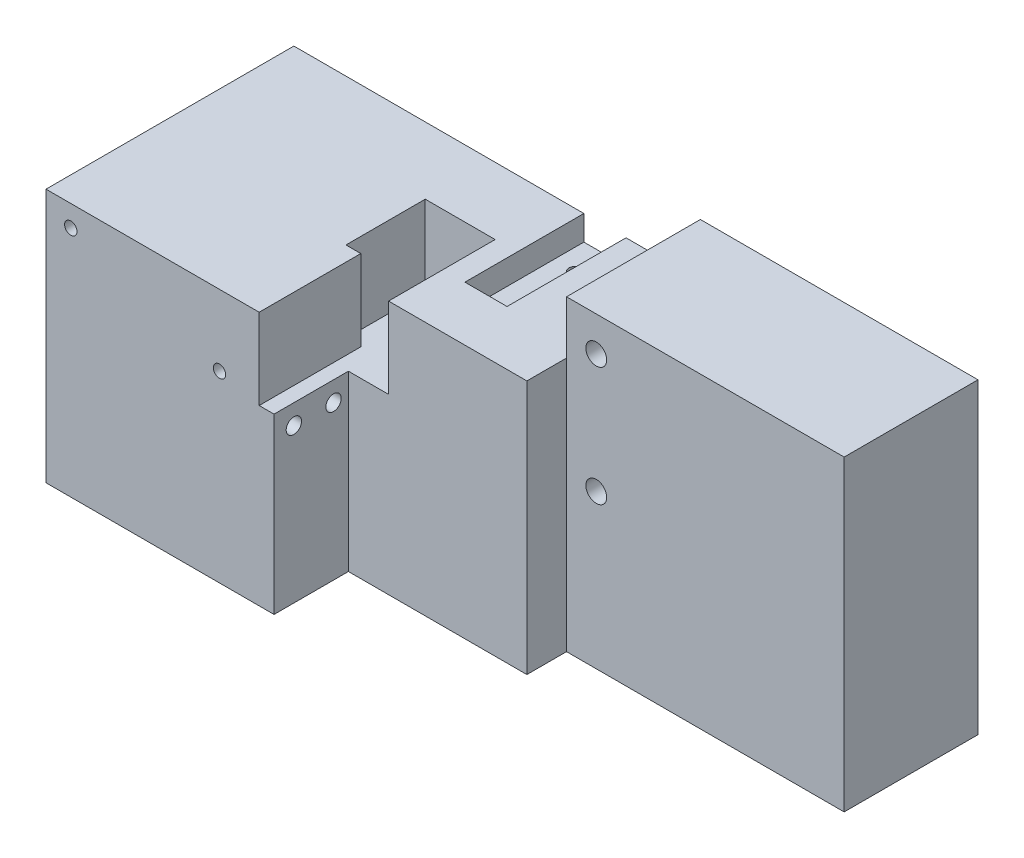
ISO-10303-21;
HEADER;
FILE_DESCRIPTION(('STEP AP214'),'2;1');
FILE_NAME('part.step','',(''),(''),'','','');
FILE_SCHEMA(('AUTOMOTIVE_DESIGN { 1 0 10303 214 1 1 1 1 }'));
ENDSEC;
DATA;
#1=APPLICATION_CONTEXT('core data for automotive mechanical design processes');
#2=APPLICATION_PROTOCOL_DEFINITION('international standard','automotive_design',2000,#1);
#3=PRODUCT_CONTEXT('',#1,'mechanical');
#4=PRODUCT('Part','Part','',(#3));
#5=PRODUCT_RELATED_PRODUCT_CATEGORY('part','',(#4));
#6=PRODUCT_DEFINITION_FORMATION('','',#4);
#7=PRODUCT_DEFINITION_CONTEXT('part definition',#1,'design');
#8=PRODUCT_DEFINITION('design','',#6,#7);
#9=PRODUCT_DEFINITION_SHAPE('','',#8);
#10=(LENGTH_UNIT() NAMED_UNIT(*) SI_UNIT(.MILLI.,.METRE.));
#11=(NAMED_UNIT(*) PLANE_ANGLE_UNIT() SI_UNIT($,.RADIAN.));
#12=(NAMED_UNIT(*) SI_UNIT($,.STERADIAN.) SOLID_ANGLE_UNIT());
#13=UNCERTAINTY_MEASURE_WITH_UNIT(LENGTH_MEASURE(1.E-05),#10,'distance_accuracy_value','');
#14=(GEOMETRIC_REPRESENTATION_CONTEXT(3) GLOBAL_UNCERTAINTY_ASSIGNED_CONTEXT((#13)) GLOBAL_UNIT_ASSIGNED_CONTEXT((#10,
#11,#12)) REPRESENTATION_CONTEXT('',''));
#15=CARTESIAN_POINT('',(0.,0.,0.));
#16=DIRECTION('',(0.,0.,1.));
#17=DIRECTION('',(1.,0.,0.));
#18=AXIS2_PLACEMENT_3D('',#15,#16,#17);
#19=CARTESIAN_POINT('',(138.,-62.,0.));
#20=DIRECTION('',(1.,0.,0.));
#21=DIRECTION('',(0.,0.,-1.));
#22=AXIS2_PLACEMENT_3D('',#19,#20,#21);
#23=PLANE('',#22);
#24=DIRECTION('',(0.,0.,-1.));
#25=VECTOR('',#24,1.);
#26=CARTESIAN_POINT('',(138.,0.,0.));
#27=LINE('',#26,#25);
#28=CARTESIAN_POINT('',(138.,0.,-23.));
#29=VERTEX_POINT('',#28);
#30=CARTESIAN_POINT('',(138.,0.,-50.));
#31=VERTEX_POINT('',#30);
#32=EDGE_CURVE('E451',#29,#31,#27,.T.);
#33=ORIENTED_EDGE('',*,*,#32,.F.);
#34=DIRECTION('',(0.,1.,0.));
#35=VECTOR('',#34,1.);
#36=CARTESIAN_POINT('',(138.,-62.,-23.));
#37=LINE('',#36,#35);
#38=CARTESIAN_POINT('',(138.,-62.,-23.));
#39=VERTEX_POINT('',#38);
#40=EDGE_CURVE('E410',#39,#29,#37,.T.);
#41=ORIENTED_EDGE('',*,*,#40,.F.);
#42=DIRECTION('',(0.,0.,-1.));
#43=VECTOR('',#42,1.);
#44=CARTESIAN_POINT('',(138.,-62.,0.));
#45=LINE('',#44,#43);
#46=CARTESIAN_POINT('',(138.,-62.,-50.));
#47=VERTEX_POINT('',#46);
#48=EDGE_CURVE('E461',#39,#47,#45,.T.);
#49=ORIENTED_EDGE('',*,*,#48,.T.);
#50=DIRECTION('',(0.,1.,0.));
#51=VECTOR('',#50,1.);
#52=CARTESIAN_POINT('',(138.,-62.,-50.));
#53=LINE('',#52,#51);
#54=EDGE_CURVE('E479',#47,#31,#53,.T.);
#55=ORIENTED_EDGE('',*,*,#54,.T.);
#56=EDGE_LOOP('',(#33,#41,#49,#55));
#57=FACE_BOUND('',#56,.T.);
#58=ADVANCED_FACE('F45',(#57),#23,.T.);
#59=CARTESIAN_POINT('',(0.,0.,0.));
#60=DIRECTION('',(0.,-1.,0.));
#61=DIRECTION('',(0.,0.,-1.));
#62=AXIS2_PLACEMENT_3D('',#59,#60,#61);
#63=PLANE('',#62);
#64=DIRECTION('',(-1.,0.,0.));
#65=VECTOR('',#64,1.);
#66=CARTESIAN_POINT('',(138.,0.,-23.));
#67=LINE('',#66,#65);
#68=CARTESIAN_POINT('',(82.,0.,-23.));
#69=VERTEX_POINT('',#68);
#70=EDGE_CURVE('E428',#29,#69,#67,.T.);
#71=ORIENTED_EDGE('',*,*,#70,.F.);
#72=ORIENTED_EDGE('',*,*,#32,.T.);
#73=DIRECTION('',(-1.,0.,0.));
#74=VECTOR('',#73,1.);
#75=CARTESIAN_POINT('',(0.,0.,-50.));
#76=LINE('',#75,#74);
#77=CARTESIAN_POINT('',(82.,0.,-50.));
#78=VERTEX_POINT('',#77);
#79=EDGE_CURVE('E457',#31,#78,#76,.T.);
#80=ORIENTED_EDGE('',*,*,#79,.T.);
#81=DIRECTION('',(0.,0.,1.));
#82=VECTOR('',#81,1.);
#83=CARTESIAN_POINT('',(82.,0.,-50.));
#84=LINE('',#83,#82);
#85=EDGE_CURVE('E447',#78,#69,#84,.T.);
#86=ORIENTED_EDGE('',*,*,#85,.T.);
#87=EDGE_LOOP('',(#71,#72,#80,#86));
#88=FACE_BOUND('',#87,.T.);
#89=ADVANCED_FACE('F563',(#88),#63,.F.);
#90=CARTESIAN_POINT('',(82.,0.,-50.));
#91=DIRECTION('',(1.,0.,0.));
#92=DIRECTION('',(0.,0.,-1.));
#93=AXIS2_PLACEMENT_3D('',#90,#91,#92);
#94=PLANE('',#93);
#95=DIRECTION('',(0.,-1.,0.));
#96=VECTOR('',#95,1.);
#97=CARTESIAN_POINT('',(82.,-62.,-23.));
#98=LINE('',#97,#96);
#99=CARTESIAN_POINT('',(82.,-10.7,-23.));
#100=VERTEX_POINT('',#99);
#101=EDGE_CURVE('E435',#69,#100,#98,.T.);
#102=ORIENTED_EDGE('',*,*,#101,.F.);
#103=ORIENTED_EDGE('',*,*,#85,.F.);
#104=DIRECTION('',(0.,1.,0.));
#105=VECTOR('',#104,1.);
#106=CARTESIAN_POINT('',(82.,0.,-50.));
#107=LINE('',#106,#105);
#108=CARTESIAN_POINT('',(82.,-10.7,-50.));
#109=VERTEX_POINT('',#108);
#110=EDGE_CURVE('E443',#109,#78,#107,.T.);
#111=ORIENTED_EDGE('',*,*,#110,.F.);
#112=DIRECTION('',(0.,0.,1.));
#113=VECTOR('',#112,1.);
#114=CARTESIAN_POINT('',(82.,-10.7,-50.));
#115=LINE('',#114,#113);
#116=EDGE_CURVE('E285',#109,#100,#115,.T.);
#117=ORIENTED_EDGE('',*,*,#116,.T.);
#118=EDGE_LOOP('',(#102,#103,#111,#117));
#119=FACE_BOUND('',#118,.T.);
#120=ADVANCED_FACE('F568',(#119),#94,.F.);
#121=CARTESIAN_POINT('',(0.,-62.,0.));
#122=DIRECTION('',(-1.,0.,0.));
#123=DIRECTION('',(0.,0.,1.));
#124=AXIS2_PLACEMENT_3D('',#121,#122,#123);
#125=PLANE('',#124);
#126=DIRECTION('',(0.,0.,1.));
#127=VECTOR('',#126,1.);
#128=CARTESIAN_POINT('',(0.,-10.7,-50.));
#129=LINE('',#128,#127);
#130=CARTESIAN_POINT('',(0.,-10.7,-50.));
#131=VERTEX_POINT('',#130);
#132=CARTESIAN_POINT('',(0.,-10.7,0.));
#133=VERTEX_POINT('',#132);
#134=EDGE_CURVE('E281',#131,#133,#129,.T.);
#135=ORIENTED_EDGE('',*,*,#134,.F.);
#136=DIRECTION('',(0.,1.,0.));
#137=VECTOR('',#136,1.);
#138=CARTESIAN_POINT('',(0.,-62.,-50.));
#139=LINE('',#138,#137);
#140=CARTESIAN_POINT('',(0.,-62.,-50.));
#141=VERTEX_POINT('',#140);
#142=EDGE_CURVE('E474',#141,#131,#139,.T.);
#143=ORIENTED_EDGE('',*,*,#142,.F.);
#144=DIRECTION('',(0.,0.,1.));
#145=VECTOR('',#144,1.);
#146=CARTESIAN_POINT('',(0.,-62.,0.));
#147=LINE('',#146,#145);
#148=CARTESIAN_POINT('',(0.,-62.,0.));
#149=VERTEX_POINT('',#148);
#150=EDGE_CURVE('E452',#141,#149,#147,.T.);
#151=ORIENTED_EDGE('',*,*,#150,.T.);
#152=DIRECTION('',(0.,1.,0.));
#153=VECTOR('',#152,1.);
#154=CARTESIAN_POINT('',(0.,-62.,0.));
#155=LINE('',#154,#153);
#156=EDGE_CURVE('E468',#149,#133,#155,.T.);
#157=ORIENTED_EDGE('',*,*,#156,.T.);
#158=EDGE_LOOP('',(#135,#143,#151,#157));
#159=FACE_BOUND('',#158,.T.);
#160=ADVANCED_FACE('F47',(#159),#125,.T.);
#161=CARTESIAN_POINT('',(0.,-62.,-50.));
#162=DIRECTION('',(0.,0.,-1.));
#163=DIRECTION('',(-1.,0.,0.));
#164=AXIS2_PLACEMENT_3D('',#161,#162,#163);
#165=PLANE('',#164);
#166=DIRECTION('',(0.,1.,0.));
#167=VECTOR('',#166,1.);
#168=CARTESIAN_POINT('',(58.5,-15.7,-50.));
#169=LINE('',#168,#167);
#170=CARTESIAN_POINT('',(58.5,-15.7,-50.));
#171=VERTEX_POINT('',#170);
#172=CARTESIAN_POINT('',(58.5,-10.7,-50.));
#173=VERTEX_POINT('',#172);
#174=EDGE_CURVE('E264',#171,#173,#169,.T.);
#175=ORIENTED_EDGE('',*,*,#174,.F.);
#176=DIRECTION('',(-1.,0.,0.));
#177=VECTOR('',#176,1.);
#178=CARTESIAN_POINT('',(58.5,-15.7,-50.));
#179=LINE('',#178,#177);
#180=CARTESIAN_POINT('',(67.,-15.7,-50.));
#181=VERTEX_POINT('',#180);
#182=EDGE_CURVE('E251',#181,#171,#179,.T.);
#183=ORIENTED_EDGE('',*,*,#182,.F.);
#184=DIRECTION('',(0.,1.,0.));
#185=VECTOR('',#184,1.);
#186=CARTESIAN_POINT('',(67.,-15.7,-50.));
#187=LINE('',#186,#185);
#188=CARTESIAN_POINT('',(67.,-10.7,-50.));
#189=VERTEX_POINT('',#188);
#190=EDGE_CURVE('E268',#181,#189,#187,.T.);
#191=ORIENTED_EDGE('',*,*,#190,.T.);
#192=DIRECTION('',(1.,0.,0.));
#193=VECTOR('',#192,1.);
#194=CARTESIAN_POINT('',(0.,-10.7,-50.));
#195=LINE('',#194,#193);
#196=EDGE_CURVE('E282',#189,#109,#195,.T.);
#197=ORIENTED_EDGE('',*,*,#196,.T.);
#198=ORIENTED_EDGE('',*,*,#110,.T.);
#199=ORIENTED_EDGE('',*,*,#79,.F.);
#200=ORIENTED_EDGE('',*,*,#54,.F.);
#201=DIRECTION('',(-1.,0.,0.));
#202=VECTOR('',#201,1.);
#203=CARTESIAN_POINT('',(0.,-62.,-50.));
#204=LINE('',#203,#202);
#205=EDGE_CURVE('E464',#47,#141,#204,.T.);
#206=ORIENTED_EDGE('',*,*,#205,.T.);
#207=ORIENTED_EDGE('',*,*,#142,.T.);
#208=EDGE_CURVE('E277',#131,#173,#195,.T.);
#209=ORIENTED_EDGE('',*,*,#208,.T.);
#210=EDGE_LOOP('',(#175,#183,#191,#197,#198,#199,#200,#206,#207,#209));
#211=FACE_BOUND('',#210,.T.);
#212=ADVANCED_FACE('F516',(#211),#165,.T.);
#213=CARTESIAN_POINT('',(0.,-62.,0.));
#214=DIRECTION('',(0.,0.,1.));
#215=DIRECTION('',(1.,0.,0.));
#216=AXIS2_PLACEMENT_3D('',#213,#214,#215);
#217=PLANE('',#216);
#218=DIRECTION('',(1.,0.,0.));
#219=VECTOR('',#218,1.);
#220=CARTESIAN_POINT('',(0.,-10.7,0.));
#221=LINE('',#220,#219);
#222=CARTESIAN_POINT('',(43.,-10.7,0.));
#223=VERTEX_POINT('',#222);
#224=EDGE_CURVE('E267',#133,#223,#221,.T.);
#225=ORIENTED_EDGE('',*,*,#224,.F.);
#226=ORIENTED_EDGE('',*,*,#156,.F.);
#227=DIRECTION('',(1.,0.,0.));
#228=VECTOR('',#227,1.);
#229=CARTESIAN_POINT('',(0.,-62.,0.));
#230=LINE('',#229,#228);
#231=CARTESIAN_POINT('',(46.,-62.,0.));
#232=VERTEX_POINT('',#231);
#233=EDGE_CURVE('E456',#149,#232,#230,.T.);
#234=ORIENTED_EDGE('',*,*,#233,.T.);
#235=DIRECTION('',(0.,1.,0.));
#236=VECTOR('',#235,1.);
#237=CARTESIAN_POINT('',(46.,-62.,0.));
#238=LINE('',#237,#236);
#239=CARTESIAN_POINT('',(46.,-27.,0.));
#240=VERTEX_POINT('',#239);
#241=EDGE_CURVE('E367',#232,#240,#238,.T.);
#242=ORIENTED_EDGE('',*,*,#241,.T.);
#243=DIRECTION('',(1.,0.,0.));
#244=VECTOR('',#243,1.);
#245=CARTESIAN_POINT('',(43.,-27.,0.));
#246=LINE('',#245,#244);
#247=CARTESIAN_POINT('',(43.,-27.,0.));
#248=VERTEX_POINT('',#247);
#249=EDGE_CURVE('E394',#248,#240,#246,.T.);
#250=ORIENTED_EDGE('',*,*,#249,.F.);
#251=DIRECTION('',(0.,1.,0.));
#252=VECTOR('',#251,1.);
#253=CARTESIAN_POINT('',(43.,-27.,0.));
#254=LINE('',#253,#252);
#255=EDGE_CURVE('E415',#248,#223,#254,.T.);
#256=ORIENTED_EDGE('',*,*,#255,.T.);
#257=EDGE_LOOP('',(#225,#226,#234,#242,#250,#256));
#258=FACE_BOUND('',#257,.T.);
#259=CARTESIAN_POINT('',(5.,-15.,0.));
#260=DIRECTION('',(0.,0.,1.));
#261=DIRECTION('',(1.,0.,0.));
#262=AXIS2_PLACEMENT_3D('',#259,#260,#261);
#263=CIRCLE('',#262,1.25);
#264=CARTESIAN_POINT('',(6.25,-15.,0.));
#265=VERTEX_POINT('',#264);
#266=EDGE_CURVE('E342',#265,#265,#263,.T.);
#267=ORIENTED_EDGE('',*,*,#266,.F.);
#268=EDGE_LOOP('',(#267));
#269=FACE_BOUND('',#268,.T.);
#270=CARTESIAN_POINT('',(35.,-25.,0.));
#271=DIRECTION('',(0.,0.,1.));
#272=DIRECTION('',(1.,0.,0.));
#273=AXIS2_PLACEMENT_3D('',#270,#271,#272);
#274=CIRCLE('',#273,1.25);
#275=CARTESIAN_POINT('',(36.25,-25.,0.));
#276=VERTEX_POINT('',#275);
#277=EDGE_CURVE('E350',#276,#276,#274,.T.);
#278=ORIENTED_EDGE('',*,*,#277,.F.);
#279=EDGE_LOOP('',(#278));
#280=FACE_BOUND('',#279,.T.);
#281=ADVANCED_FACE('F498',(#258,#269,#280),#217,.T.);
#282=CARTESIAN_POINT('',(0.,-62.,0.));
#283=DIRECTION('',(0.,-1.,0.));
#284=DIRECTION('',(0.,0.,-1.));
#285=AXIS2_PLACEMENT_3D('',#282,#283,#284);
#286=PLANE('',#285);
#287=CARTESIAN_POINT('',(128.,-62.,-35.));
#288=DIRECTION('',(0.,-1.,0.));
#289=DIRECTION('',(0.,0.,-1.));
#290=AXIS2_PLACEMENT_3D('',#287,#288,#289);
#291=CIRCLE('',#290,1.65000000000001);
#292=CARTESIAN_POINT('',(128.,-62.,-36.65));
#293=VERTEX_POINT('',#292);
#294=EDGE_CURVE('E326',#293,#293,#291,.T.);
#295=ORIENTED_EDGE('',*,*,#294,.F.);
#296=EDGE_LOOP('',(#295));
#297=FACE_BOUND('',#296,.T.);
#298=CARTESIAN_POINT('',(10.,-62.,-35.));
#299=DIRECTION('',(0.,-1.,0.));
#300=DIRECTION('',(0.,0.,-1.));
#301=AXIS2_PLACEMENT_3D('',#298,#299,#300);
#302=CIRCLE('',#301,1.65);
#303=CARTESIAN_POINT('',(10.,-62.,-36.65));
#304=VERTEX_POINT('',#303);
#305=EDGE_CURVE('E334',#304,#304,#302,.T.);
#306=ORIENTED_EDGE('',*,*,#305,.F.);
#307=EDGE_LOOP('',(#306));
#308=FACE_BOUND('',#307,.T.);
#309=DIRECTION('',(0.,0.,1.));
#310=VECTOR('',#309,1.);
#311=CARTESIAN_POINT('',(46.,-62.,0.));
#312=LINE('',#311,#310);
#313=CARTESIAN_POINT('',(46.,-62.,-15.));
#314=VERTEX_POINT('',#313);
#315=EDGE_CURVE('E362',#314,#232,#312,.T.);
#316=ORIENTED_EDGE('',*,*,#315,.T.);
#317=ORIENTED_EDGE('',*,*,#233,.F.);
#318=ORIENTED_EDGE('',*,*,#150,.F.);
#319=ORIENTED_EDGE('',*,*,#205,.F.);
#320=ORIENTED_EDGE('',*,*,#48,.F.);
#321=DIRECTION('',(1.,0.,0.));
#322=VECTOR('',#321,1.);
#323=CARTESIAN_POINT('',(138.,-62.,-23.));
#324=LINE('',#323,#322);
#325=CARTESIAN_POINT('',(82.,-62.,-23.));
#326=VERTEX_POINT('',#325);
#327=EDGE_CURVE('E436',#326,#39,#324,.T.);
#328=ORIENTED_EDGE('',*,*,#327,.F.);
#329=DIRECTION('',(0.,0.,1.));
#330=VECTOR('',#329,1.);
#331=CARTESIAN_POINT('',(82.,-62.,-23.));
#332=LINE('',#331,#330);
#333=CARTESIAN_POINT('',(82.,-62.,-15.));
#334=VERTEX_POINT('',#333);
#335=EDGE_CURVE('E439',#326,#334,#332,.T.);
#336=ORIENTED_EDGE('',*,*,#335,.T.);
#337=DIRECTION('',(-1.,0.,0.));
#338=VECTOR('',#337,1.);
#339=CARTESIAN_POINT('',(82.,-62.,-15.));
#340=LINE('',#339,#338);
#341=EDGE_CURVE('E358',#334,#314,#340,.T.);
#342=ORIENTED_EDGE('',*,*,#341,.T.);
#343=EDGE_LOOP('',(#316,#317,#318,#319,#320,#328,#336,#342));
#344=FACE_BOUND('',#343,.T.);
#345=ADVANCED_FACE('F511',(#297,#308,#344),#286,.T.);
#346=CARTESIAN_POINT('',(82.,-62.,-23.));
#347=DIRECTION('',(-1.,0.,0.));
#348=DIRECTION('',(0.,0.,1.));
#349=AXIS2_PLACEMENT_3D('',#346,#347,#348);
#350=PLANE('',#349);
#351=EDGE_CURVE('E432',#100,#326,#98,.T.);
#352=ORIENTED_EDGE('',*,*,#351,.F.);
#353=CARTESIAN_POINT('',(82.,-10.7,-15.));
#354=VERTEX_POINT('',#353);
#355=EDGE_CURVE('E289',#100,#354,#115,.T.);
#356=ORIENTED_EDGE('',*,*,#355,.T.);
#357=DIRECTION('',(0.,1.,0.));
#358=VECTOR('',#357,1.);
#359=CARTESIAN_POINT('',(82.,-62.,-15.));
#360=LINE('',#359,#358);
#361=EDGE_CURVE('E366',#334,#354,#360,.T.);
#362=ORIENTED_EDGE('',*,*,#361,.F.);
#363=ORIENTED_EDGE('',*,*,#335,.F.);
#364=EDGE_LOOP('',(#352,#356,#362,#363));
#365=FACE_BOUND('',#364,.T.);
#366=ADVANCED_FACE('F531',(#365),#350,.F.);
#367=CARTESIAN_POINT('',(0.,0.,-23.));
#368=DIRECTION('',(0.,0.,1.));
#369=DIRECTION('',(1.,0.,0.));
#370=AXIS2_PLACEMENT_3D('',#367,#368,#369);
#371=PLANE('',#370);
#372=CARTESIAN_POINT('',(88.,-7.,-23.));
#373=DIRECTION('',(0.,0.,1.));
#374=DIRECTION('',(1.,0.,0.));
#375=AXIS2_PLACEMENT_3D('',#372,#373,#374);
#376=CIRCLE('',#375,2.1);
#377=CARTESIAN_POINT('',(90.1,-7.,-23.));
#378=VERTEX_POINT('',#377);
#379=EDGE_CURVE('E216',#378,#378,#376,.T.);
#380=ORIENTED_EDGE('',*,*,#379,.F.);
#381=EDGE_LOOP('',(#380));
#382=FACE_BOUND('',#381,.T.);
#383=CARTESIAN_POINT('',(88.,-31.,-23.));
#384=DIRECTION('',(0.,0.,1.));
#385=DIRECTION('',(1.,0.,0.));
#386=AXIS2_PLACEMENT_3D('',#383,#384,#385);
#387=CIRCLE('',#386,2.1);
#388=CARTESIAN_POINT('',(90.1,-31.,-23.));
#389=VERTEX_POINT('',#388);
#390=EDGE_CURVE('E215',#389,#389,#387,.T.);
#391=ORIENTED_EDGE('',*,*,#390,.F.);
#392=EDGE_LOOP('',(#391));
#393=FACE_BOUND('',#392,.T.);
#394=ORIENTED_EDGE('',*,*,#40,.T.);
#395=ORIENTED_EDGE('',*,*,#70,.T.);
#396=ORIENTED_EDGE('',*,*,#101,.T.);
#397=ORIENTED_EDGE('',*,*,#351,.T.);
#398=ORIENTED_EDGE('',*,*,#327,.T.);
#399=EDGE_LOOP('',(#394,#395,#396,#397,#398));
#400=FACE_BOUND('',#399,.T.);
#401=ADVANCED_FACE('F524',(#382,#393,#400),#371,.T.);
#402=CARTESIAN_POINT('',(40.,-27.,-36.5));
#403=DIRECTION('',(-1.,0.,0.));
#404=DIRECTION('',(0.,0.,1.));
#405=AXIS2_PLACEMENT_3D('',#402,#403,#404);
#406=PLANE('',#405);
#407=DIRECTION('',(0.,1.,0.));
#408=VECTOR('',#407,1.);
#409=CARTESIAN_POINT('',(40.,-27.,-36.5));
#410=LINE('',#409,#408);
#411=CARTESIAN_POINT('',(40.,-27.,-36.5));
#412=VERTEX_POINT('',#411);
#413=CARTESIAN_POINT('',(40.,-10.7,-36.5));
#414=VERTEX_POINT('',#413);
#415=EDGE_CURVE('E406',#412,#414,#410,.T.);
#416=ORIENTED_EDGE('',*,*,#415,.T.);
#417=DIRECTION('',(0.,0.,1.));
#418=VECTOR('',#417,1.);
#419=CARTESIAN_POINT('',(40.,-10.7,-36.5));
#420=LINE('',#419,#418);
#421=CARTESIAN_POINT('',(40.,-10.7,-20.5));
#422=VERTEX_POINT('',#421);
#423=EDGE_CURVE('E298',#414,#422,#420,.T.);
#424=ORIENTED_EDGE('',*,*,#423,.T.);
#425=DIRECTION('',(0.,1.,0.));
#426=VECTOR('',#425,1.);
#427=CARTESIAN_POINT('',(40.,-27.,-20.5));
#428=LINE('',#427,#426);
#429=CARTESIAN_POINT('',(40.,-27.,-20.5));
#430=VERTEX_POINT('',#429);
#431=EDGE_CURVE('E405',#430,#422,#428,.T.);
#432=ORIENTED_EDGE('',*,*,#431,.F.);
#433=DIRECTION('',(0.,0.,1.));
#434=VECTOR('',#433,1.);
#435=CARTESIAN_POINT('',(40.,-27.,-36.5));
#436=LINE('',#435,#434);
#437=EDGE_CURVE('E382',#412,#430,#436,.T.);
#438=ORIENTED_EDGE('',*,*,#437,.F.);
#439=EDGE_LOOP('',(#416,#424,#432,#438));
#440=FACE_BOUND('',#439,.T.);
#441=ADVANCED_FACE('F543',(#440),#406,.F.);
#442=CARTESIAN_POINT('',(40.,-27.,-36.5));
#443=DIRECTION('',(0.,0.,-1.));
#444=DIRECTION('',(-1.,0.,0.));
#445=AXIS2_PLACEMENT_3D('',#442,#443,#444);
#446=PLANE('',#445);
#447=DIRECTION('',(0.,1.,0.));
#448=VECTOR('',#447,1.);
#449=CARTESIAN_POINT('',(54.1,-27.,-36.5));
#450=LINE('',#449,#448);
#451=CARTESIAN_POINT('',(54.1,-27.,-36.5));
#452=VERTEX_POINT('',#451);
#453=CARTESIAN_POINT('',(54.1,-10.7,-36.5));
#454=VERTEX_POINT('',#453);
#455=EDGE_CURVE('E411',#452,#454,#450,.T.);
#456=ORIENTED_EDGE('',*,*,#455,.T.);
#457=DIRECTION('',(-1.,0.,0.));
#458=VECTOR('',#457,1.);
#459=CARTESIAN_POINT('',(40.,-10.7,-36.5));
#460=LINE('',#459,#458);
#461=EDGE_CURVE('E294',#454,#414,#460,.T.);
#462=ORIENTED_EDGE('',*,*,#461,.T.);
#463=ORIENTED_EDGE('',*,*,#415,.F.);
#464=DIRECTION('',(-1.,0.,0.));
#465=VECTOR('',#464,1.);
#466=CARTESIAN_POINT('',(40.,-27.,-36.5));
#467=LINE('',#466,#465);
#468=EDGE_CURVE('E401',#452,#412,#467,.T.);
#469=ORIENTED_EDGE('',*,*,#468,.F.);
#470=EDGE_LOOP('',(#456,#462,#463,#469));
#471=FACE_BOUND('',#470,.T.);
#472=ADVANCED_FACE('F540',(#471),#446,.F.);
#473=CARTESIAN_POINT('',(54.1,-27.,-36.5));
#474=DIRECTION('',(1.,0.,0.));
#475=DIRECTION('',(0.,0.,-1.));
#476=AXIS2_PLACEMENT_3D('',#473,#474,#475);
#477=PLANE('',#476);
#478=DIRECTION('',(0.,1.,0.));
#479=VECTOR('',#478,1.);
#480=CARTESIAN_POINT('',(54.1,-27.,-15.));
#481=LINE('',#480,#479);
#482=CARTESIAN_POINT('',(54.1,-27.,-15.));
#483=VERTEX_POINT('',#482);
#484=CARTESIAN_POINT('',(54.1,-10.7,-15.));
#485=VERTEX_POINT('',#484);
#486=EDGE_CURVE('E371',#483,#485,#481,.T.);
#487=ORIENTED_EDGE('',*,*,#486,.T.);
#488=DIRECTION('',(0.,0.,-1.));
#489=VECTOR('',#488,1.);
#490=CARTESIAN_POINT('',(54.1,-10.7,-36.5));
#491=LINE('',#490,#489);
#492=EDGE_CURVE('E69',#485,#454,#491,.T.);
#493=ORIENTED_EDGE('',*,*,#492,.T.);
#494=ORIENTED_EDGE('',*,*,#455,.F.);
#495=DIRECTION('',(0.,0.,-1.));
#496=VECTOR('',#495,1.);
#497=CARTESIAN_POINT('',(54.1,-27.,-36.5));
#498=LINE('',#497,#496);
#499=EDGE_CURVE('E398',#483,#452,#498,.T.);
#500=ORIENTED_EDGE('',*,*,#499,.F.);
#501=EDGE_LOOP('',(#487,#493,#494,#500));
#502=FACE_BOUND('',#501,.T.);
#503=ADVANCED_FACE('F537',(#502),#477,.F.);
#504=CARTESIAN_POINT('',(43.,-27.,-20.5));
#505=DIRECTION('',(-1.,0.,0.));
#506=DIRECTION('',(0.,0.,1.));
#507=AXIS2_PLACEMENT_3D('',#504,#505,#506);
#508=PLANE('',#507);
#509=DIRECTION('',(0.,1.,0.));
#510=VECTOR('',#509,1.);
#511=CARTESIAN_POINT('',(43.,-27.,-20.5));
#512=LINE('',#511,#510);
#513=CARTESIAN_POINT('',(43.,-27.,-20.5));
#514=VERTEX_POINT('',#513);
#515=CARTESIAN_POINT('',(43.,-10.7,-20.5));
#516=VERTEX_POINT('',#515);
#517=EDGE_CURVE('E419',#514,#516,#512,.T.);
#518=ORIENTED_EDGE('',*,*,#517,.T.);
#519=DIRECTION('',(0.,0.,1.));
#520=VECTOR('',#519,1.);
#521=CARTESIAN_POINT('',(43.,-10.7,-20.5));
#522=LINE('',#521,#520);
#523=EDGE_CURVE('E306',#516,#223,#522,.T.);
#524=ORIENTED_EDGE('',*,*,#523,.T.);
#525=ORIENTED_EDGE('',*,*,#255,.F.);
#526=DIRECTION('',(0.,0.,1.));
#527=VECTOR('',#526,1.);
#528=CARTESIAN_POINT('',(43.,-27.,-20.5));
#529=LINE('',#528,#527);
#530=EDGE_CURVE('E390',#514,#248,#529,.T.);
#531=ORIENTED_EDGE('',*,*,#530,.F.);
#532=EDGE_LOOP('',(#518,#524,#525,#531));
#533=FACE_BOUND('',#532,.T.);
#534=ADVANCED_FACE('F505',(#533),#508,.F.);
#535=CARTESIAN_POINT('',(40.,-27.,-20.5));
#536=DIRECTION('',(0.,0.,1.));
#537=DIRECTION('',(1.,0.,0.));
#538=AXIS2_PLACEMENT_3D('',#535,#536,#537);
#539=PLANE('',#538);
#540=ORIENTED_EDGE('',*,*,#431,.T.);
#541=DIRECTION('',(1.,0.,0.));
#542=VECTOR('',#541,1.);
#543=CARTESIAN_POINT('',(40.,-10.7,-20.5));
#544=LINE('',#543,#542);
#545=EDGE_CURVE('E302',#422,#516,#544,.T.);
#546=ORIENTED_EDGE('',*,*,#545,.T.);
#547=ORIENTED_EDGE('',*,*,#517,.F.);
#548=DIRECTION('',(1.,0.,0.));
#549=VECTOR('',#548,1.);
#550=CARTESIAN_POINT('',(40.,-27.,-20.5));
#551=LINE('',#550,#549);
#552=EDGE_CURVE('E386',#430,#514,#551,.T.);
#553=ORIENTED_EDGE('',*,*,#552,.F.);
#554=EDGE_LOOP('',(#540,#546,#547,#553));
#555=FACE_BOUND('',#554,.T.);
#556=ADVANCED_FACE('F545',(#555),#539,.F.);
#557=CARTESIAN_POINT('',(0.,-27.,0.));
#558=DIRECTION('',(0.,1.,0.));
#559=DIRECTION('',(0.,0.,1.));
#560=AXIS2_PLACEMENT_3D('',#557,#558,#559);
#561=PLANE('',#560);
#562=DIRECTION('',(0.,0.,1.));
#563=VECTOR('',#562,1.);
#564=CARTESIAN_POINT('',(46.,-27.,0.));
#565=LINE('',#564,#563);
#566=CARTESIAN_POINT('',(46.,-27.,-15.));
#567=VERTEX_POINT('',#566);
#568=EDGE_CURVE('E54',#567,#240,#565,.T.);
#569=ORIENTED_EDGE('',*,*,#568,.F.);
#570=DIRECTION('',(-1.,0.,0.));
#571=VECTOR('',#570,1.);
#572=CARTESIAN_POINT('',(0.,-27.,-15.));
#573=LINE('',#572,#571);
#574=EDGE_CURVE('E478',#483,#567,#573,.T.);
#575=ORIENTED_EDGE('',*,*,#574,.F.);
#576=ORIENTED_EDGE('',*,*,#499,.T.);
#577=ORIENTED_EDGE('',*,*,#468,.T.);
#578=ORIENTED_EDGE('',*,*,#437,.T.);
#579=ORIENTED_EDGE('',*,*,#552,.T.);
#580=ORIENTED_EDGE('',*,*,#530,.T.);
#581=ORIENTED_EDGE('',*,*,#249,.T.);
#582=EDGE_LOOP('',(#569,#575,#576,#577,#578,#579,#580,#581));
#583=FACE_BOUND('',#582,.T.);
#584=ADVANCED_FACE('F501',(#583),#561,.T.);
#585=CARTESIAN_POINT('',(82.,-62.,-15.));
#586=DIRECTION('',(0.,0.,-1.));
#587=DIRECTION('',(-1.,0.,0.));
#588=AXIS2_PLACEMENT_3D('',#585,#586,#587);
#589=PLANE('',#588);
#590=ORIENTED_EDGE('',*,*,#361,.T.);
#591=DIRECTION('',(-1.,0.,0.));
#592=VECTOR('',#591,1.);
#593=CARTESIAN_POINT('',(82.,-10.7,-15.));
#594=LINE('',#593,#592);
#595=EDGE_CURVE('E11',#354,#485,#594,.T.);
#596=ORIENTED_EDGE('',*,*,#595,.T.);
#597=ORIENTED_EDGE('',*,*,#486,.F.);
#598=ORIENTED_EDGE('',*,*,#574,.T.);
#599=DIRECTION('',(0.,1.,0.));
#600=VECTOR('',#599,1.);
#601=CARTESIAN_POINT('',(46.,-62.,-15.));
#602=LINE('',#601,#600);
#603=EDGE_CURVE('E372',#314,#567,#602,.T.);
#604=ORIENTED_EDGE('',*,*,#603,.F.);
#605=ORIENTED_EDGE('',*,*,#341,.F.);
#606=EDGE_LOOP('',(#590,#596,#597,#598,#604,#605));
#607=FACE_BOUND('',#606,.T.);
#608=ADVANCED_FACE('F533',(#607),#589,.F.);
#609=CARTESIAN_POINT('',(46.,-62.,0.));
#610=DIRECTION('',(-1.,0.,0.));
#611=DIRECTION('',(0.,0.,1.));
#612=AXIS2_PLACEMENT_3D('',#609,#610,#611);
#613=PLANE('',#612);
#614=CARTESIAN_POINT('',(46.,-31.,-3.99999999999999));
#615=DIRECTION('',(1.,0.,0.));
#616=DIRECTION('',(0.,0.,-1.));
#617=AXIS2_PLACEMENT_3D('',#614,#615,#616);
#618=CIRCLE('',#617,1.54999999999999);
#619=CARTESIAN_POINT('',(46.,-31.,-5.54999999999998));
#620=VERTEX_POINT('',#619);
#621=EDGE_CURVE('E310',#620,#620,#618,.T.);
#622=ORIENTED_EDGE('',*,*,#621,.F.);
#623=EDGE_LOOP('',(#622));
#624=FACE_BOUND('',#623,.T.);
#625=CARTESIAN_POINT('',(46.,-31.,-12.));
#626=DIRECTION('',(1.,0.,0.));
#627=DIRECTION('',(0.,0.,-1.));
#628=AXIS2_PLACEMENT_3D('',#625,#626,#627);
#629=CIRCLE('',#628,1.54999999999999);
#630=CARTESIAN_POINT('',(46.,-31.,-13.55));
#631=VERTEX_POINT('',#630);
#632=EDGE_CURVE('E318',#631,#631,#629,.T.);
#633=ORIENTED_EDGE('',*,*,#632,.F.);
#634=EDGE_LOOP('',(#633));
#635=FACE_BOUND('',#634,.T.);
#636=ORIENTED_EDGE('',*,*,#568,.T.);
#637=ORIENTED_EDGE('',*,*,#241,.F.);
#638=ORIENTED_EDGE('',*,*,#315,.F.);
#639=ORIENTED_EDGE('',*,*,#603,.T.);
#640=EDGE_LOOP('',(#636,#637,#638,#639));
#641=FACE_BOUND('',#640,.T.);
#642=ADVANCED_FACE('F491',(#624,#635,#641),#613,.F.);
#643=CARTESIAN_POINT('',(35.,-25.,-12.4));
#644=DIRECTION('',(0.,0.,1.));
#645=DIRECTION('',(1.,0.,0.));
#646=AXIS2_PLACEMENT_3D('',#643,#644,#645);
#647=CONICAL_SURFACE('',#646,1.24999999999999,1.02974425867665);
#648=CARTESIAN_POINT('',(35.,-25.,-13.1510757737845));
#649=VERTEX_POINT('',#648);
#650=VERTEX_LOOP('',#649);
#651=FACE_BOUND('',#650,.T.);
#652=CARTESIAN_POINT('',(35.,-25.,-12.4));
#653=DIRECTION('',(0.,0.,1.));
#654=DIRECTION('',(1.,0.,0.));
#655=AXIS2_PLACEMENT_3D('',#652,#653,#654);
#656=CIRCLE('',#655,1.24999999999999);
#657=CARTESIAN_POINT('',(36.25,-25.,-12.4));
#658=VERTEX_POINT('',#657);
#659=EDGE_CURVE('E354',#658,#658,#656,.T.);
#660=ORIENTED_EDGE('',*,*,#659,.T.);
#661=EDGE_LOOP('',(#660));
#662=FACE_BOUND('',#661,.T.);
#663=ADVANCED_FACE('F611',(#651,#662),#647,.F.);
#664=CARTESIAN_POINT('',(35.,-25.,0.));
#665=DIRECTION('',(0.,0.,1.));
#666=DIRECTION('',(1.,0.,0.));
#667=AXIS2_PLACEMENT_3D('',#664,#665,#666);
#668=CYLINDRICAL_SURFACE('',#667,1.25);
#669=ORIENTED_EDGE('',*,*,#659,.F.);
#670=EDGE_LOOP('',(#669));
#671=FACE_BOUND('',#670,.T.);
#672=ORIENTED_EDGE('',*,*,#277,.T.);
#673=EDGE_LOOP('',(#672));
#674=FACE_BOUND('',#673,.T.);
#675=ADVANCED_FACE('F615',(#671,#674),#668,.F.);
#676=CARTESIAN_POINT('',(5.,-15.,-12.4));
#677=DIRECTION('',(0.,0.,1.));
#678=DIRECTION('',(1.,0.,0.));
#679=AXIS2_PLACEMENT_3D('',#676,#677,#678);
#680=CONICAL_SURFACE('',#679,1.25,1.02974425867665);
#681=CARTESIAN_POINT('',(5.,-15.,-13.1510757737845));
#682=VERTEX_POINT('',#681);
#683=VERTEX_LOOP('',#682);
#684=FACE_BOUND('',#683,.T.);
#685=CARTESIAN_POINT('',(5.,-15.,-12.4));
#686=DIRECTION('',(0.,0.,1.));
#687=DIRECTION('',(1.,0.,0.));
#688=AXIS2_PLACEMENT_3D('',#685,#686,#687);
#689=CIRCLE('',#688,1.25);
#690=CARTESIAN_POINT('',(6.25,-15.,-12.4));
#691=VERTEX_POINT('',#690);
#692=EDGE_CURVE('E346',#691,#691,#689,.T.);
#693=ORIENTED_EDGE('',*,*,#692,.T.);
#694=EDGE_LOOP('',(#693));
#695=FACE_BOUND('',#694,.T.);
#696=ADVANCED_FACE('F619',(#684,#695),#680,.F.);
#697=CARTESIAN_POINT('',(5.,-15.,0.));
#698=DIRECTION('',(0.,0.,1.));
#699=DIRECTION('',(1.,0.,0.));
#700=AXIS2_PLACEMENT_3D('',#697,#698,#699);
#701=CYLINDRICAL_SURFACE('',#700,1.25);
#702=ORIENTED_EDGE('',*,*,#692,.F.);
#703=EDGE_LOOP('',(#702));
#704=FACE_BOUND('',#703,.T.);
#705=ORIENTED_EDGE('',*,*,#266,.T.);
#706=EDGE_LOOP('',(#705));
#707=FACE_BOUND('',#706,.T.);
#708=ADVANCED_FACE('F623',(#704,#707),#701,.F.);
#709=CARTESIAN_POINT('',(10.,-51.9,-35.));
#710=DIRECTION('',(0.,-1.,0.));
#711=DIRECTION('',(0.,0.,-1.));
#712=AXIS2_PLACEMENT_3D('',#709,#710,#711);
#713=CONICAL_SURFACE('',#712,1.65,1.02974425867665);
#714=CARTESIAN_POINT('',(10.,-50.9085799786045,-35.));
#715=VERTEX_POINT('',#714);
#716=VERTEX_LOOP('',#715);
#717=FACE_BOUND('',#716,.T.);
#718=CARTESIAN_POINT('',(10.,-51.9,-35.));
#719=DIRECTION('',(0.,-1.,0.));
#720=DIRECTION('',(0.,0.,-1.));
#721=AXIS2_PLACEMENT_3D('',#718,#719,#720);
#722=CIRCLE('',#721,1.65);
#723=CARTESIAN_POINT('',(10.,-51.9,-36.65));
#724=VERTEX_POINT('',#723);
#725=EDGE_CURVE('E338',#724,#724,#722,.T.);
#726=ORIENTED_EDGE('',*,*,#725,.T.);
#727=EDGE_LOOP('',(#726));
#728=FACE_BOUND('',#727,.T.);
#729=ADVANCED_FACE('F627',(#717,#728),#713,.F.);
#730=CARTESIAN_POINT('',(10.,-62.,-35.));
#731=DIRECTION('',(0.,-1.,0.));
#732=DIRECTION('',(0.,0.,-1.));
#733=AXIS2_PLACEMENT_3D('',#730,#731,#732);
#734=CYLINDRICAL_SURFACE('',#733,1.65);
#735=ORIENTED_EDGE('',*,*,#725,.F.);
#736=EDGE_LOOP('',(#735));
#737=FACE_BOUND('',#736,.T.);
#738=ORIENTED_EDGE('',*,*,#305,.T.);
#739=EDGE_LOOP('',(#738));
#740=FACE_BOUND('',#739,.T.);
#741=ADVANCED_FACE('F631',(#737,#740),#734,.F.);
#742=CARTESIAN_POINT('',(128.,-51.9,-35.));
#743=DIRECTION('',(0.,-1.,0.));
#744=DIRECTION('',(0.,0.,-1.));
#745=AXIS2_PLACEMENT_3D('',#742,#743,#744);
#746=CONICAL_SURFACE('',#745,1.64999999999998,1.02974425867665);
#747=CARTESIAN_POINT('',(128.,-50.9085799786045,-35.));
#748=VERTEX_POINT('',#747);
#749=VERTEX_LOOP('',#748);
#750=FACE_BOUND('',#749,.T.);
#751=CARTESIAN_POINT('',(128.,-51.9,-35.));
#752=DIRECTION('',(0.,-1.,0.));
#753=DIRECTION('',(0.,0.,-1.));
#754=AXIS2_PLACEMENT_3D('',#751,#752,#753);
#755=CIRCLE('',#754,1.64999999999998);
#756=CARTESIAN_POINT('',(128.,-51.9,-36.65));
#757=VERTEX_POINT('',#756);
#758=EDGE_CURVE('E330',#757,#757,#755,.T.);
#759=ORIENTED_EDGE('',*,*,#758,.T.);
#760=EDGE_LOOP('',(#759));
#761=FACE_BOUND('',#760,.T.);
#762=ADVANCED_FACE('F635',(#750,#761),#746,.F.);
#763=CARTESIAN_POINT('',(128.,-62.,-35.));
#764=DIRECTION('',(0.,-1.,0.));
#765=DIRECTION('',(0.,0.,-1.));
#766=AXIS2_PLACEMENT_3D('',#763,#764,#765);
#767=CYLINDRICAL_SURFACE('',#766,1.65);
#768=ORIENTED_EDGE('',*,*,#758,.F.);
#769=EDGE_LOOP('',(#768));
#770=FACE_BOUND('',#769,.T.);
#771=ORIENTED_EDGE('',*,*,#294,.T.);
#772=EDGE_LOOP('',(#771));
#773=FACE_BOUND('',#772,.T.);
#774=ADVANCED_FACE('F639',(#770,#773),#767,.F.);
#775=CARTESIAN_POINT('',(36.,-31.,-12.));
#776=DIRECTION('',(1.,0.,0.));
#777=DIRECTION('',(0.,0.,-1.));
#778=AXIS2_PLACEMENT_3D('',#775,#776,#777);
#779=CONICAL_SURFACE('',#778,1.54999999999999,1.02974425867665);
#780=CARTESIAN_POINT('',(35.0686660405073,-31.,-12.));
#781=VERTEX_POINT('',#780);
#782=VERTEX_LOOP('',#781);
#783=FACE_BOUND('',#782,.T.);
#784=CARTESIAN_POINT('',(36.,-31.,-12.));
#785=DIRECTION('',(1.,0.,0.));
#786=DIRECTION('',(0.,0.,-1.));
#787=AXIS2_PLACEMENT_3D('',#784,#785,#786);
#788=CIRCLE('',#787,1.54999999999999);
#789=CARTESIAN_POINT('',(36.,-31.,-13.55));
#790=VERTEX_POINT('',#789);
#791=EDGE_CURVE('E322',#790,#790,#788,.T.);
#792=ORIENTED_EDGE('',*,*,#791,.T.);
#793=EDGE_LOOP('',(#792));
#794=FACE_BOUND('',#793,.T.);
#795=ADVANCED_FACE('F643',(#783,#794),#779,.F.);
#796=CARTESIAN_POINT('',(46.,-31.,-12.));
#797=DIRECTION('',(1.,0.,0.));
#798=DIRECTION('',(0.,0.,-1.));
#799=AXIS2_PLACEMENT_3D('',#796,#797,#798);
#800=CYLINDRICAL_SURFACE('',#799,1.54999999999999);
#801=ORIENTED_EDGE('',*,*,#791,.F.);
#802=EDGE_LOOP('',(#801));
#803=FACE_BOUND('',#802,.T.);
#804=ORIENTED_EDGE('',*,*,#632,.T.);
#805=EDGE_LOOP('',(#804));
#806=FACE_BOUND('',#805,.T.);
#807=ADVANCED_FACE('F647',(#803,#806),#800,.F.);
#808=CARTESIAN_POINT('',(36.,-31.,-3.99999999999999));
#809=DIRECTION('',(1.,0.,0.));
#810=DIRECTION('',(0.,0.,-1.));
#811=AXIS2_PLACEMENT_3D('',#808,#809,#810);
#812=CONICAL_SURFACE('',#811,1.54999999999999,1.02974425867665);
#813=CARTESIAN_POINT('',(35.0686660405073,-31.,-3.99999999999999));
#814=VERTEX_POINT('',#813);
#815=VERTEX_LOOP('',#814);
#816=FACE_BOUND('',#815,.T.);
#817=CARTESIAN_POINT('',(36.,-31.,-3.99999999999999));
#818=DIRECTION('',(1.,0.,0.));
#819=DIRECTION('',(0.,0.,-1.));
#820=AXIS2_PLACEMENT_3D('',#817,#818,#819);
#821=CIRCLE('',#820,1.54999999999999);
#822=CARTESIAN_POINT('',(36.,-31.,-5.54999999999998));
#823=VERTEX_POINT('',#822);
#824=EDGE_CURVE('E314',#823,#823,#821,.T.);
#825=ORIENTED_EDGE('',*,*,#824,.T.);
#826=EDGE_LOOP('',(#825));
#827=FACE_BOUND('',#826,.T.);
#828=ADVANCED_FACE('F559',(#816,#827),#812,.F.);
#829=CARTESIAN_POINT('',(46.,-31.,-3.99999999999999));
#830=DIRECTION('',(1.,0.,0.));
#831=DIRECTION('',(0.,0.,-1.));
#832=AXIS2_PLACEMENT_3D('',#829,#830,#831);
#833=CYLINDRICAL_SURFACE('',#832,1.54999999999999);
#834=ORIENTED_EDGE('',*,*,#824,.F.);
#835=EDGE_LOOP('',(#834));
#836=FACE_BOUND('',#835,.T.);
#837=ORIENTED_EDGE('',*,*,#621,.T.);
#838=EDGE_LOOP('',(#837));
#839=FACE_BOUND('',#838,.T.);
#840=ADVANCED_FACE('F551',(#836,#839),#833,.F.);
#841=CARTESIAN_POINT('',(0.,-10.7,-50.));
#842=DIRECTION('',(0.,-1.,0.));
#843=DIRECTION('',(0.,0.,-1.));
#844=AXIS2_PLACEMENT_3D('',#841,#842,#843);
#845=PLANE('',#844);
#846=DIRECTION('',(1.,0.,0.));
#847=VECTOR('',#846,1.);
#848=CARTESIAN_POINT('',(58.5,-10.7,-26.));
#849=LINE('',#848,#847);
#850=CARTESIAN_POINT('',(58.5,-10.7,-26.));
#851=VERTEX_POINT('',#850);
#852=CARTESIAN_POINT('',(67.,-10.7,-26.));
#853=VERTEX_POINT('',#852);
#854=EDGE_CURVE('E258',#851,#853,#849,.T.);
#855=ORIENTED_EDGE('',*,*,#854,.F.);
#856=DIRECTION('',(0.,0.,1.));
#857=VECTOR('',#856,1.);
#858=CARTESIAN_POINT('',(58.5,-10.7,-50.));
#859=LINE('',#858,#857);
#860=EDGE_CURVE('E61',#173,#851,#859,.T.);
#861=ORIENTED_EDGE('',*,*,#860,.F.);
#862=ORIENTED_EDGE('',*,*,#208,.F.);
#863=ORIENTED_EDGE('',*,*,#134,.T.);
#864=ORIENTED_EDGE('',*,*,#224,.T.);
#865=ORIENTED_EDGE('',*,*,#523,.F.);
#866=ORIENTED_EDGE('',*,*,#545,.F.);
#867=ORIENTED_EDGE('',*,*,#423,.F.);
#868=ORIENTED_EDGE('',*,*,#461,.F.);
#869=ORIENTED_EDGE('',*,*,#492,.F.);
#870=ORIENTED_EDGE('',*,*,#595,.F.);
#871=ORIENTED_EDGE('',*,*,#355,.F.);
#872=ORIENTED_EDGE('',*,*,#116,.F.);
#873=ORIENTED_EDGE('',*,*,#196,.F.);
#874=DIRECTION('',(0.,0.,-1.));
#875=VECTOR('',#874,1.);
#876=CARTESIAN_POINT('',(67.,-10.7,-50.));
#877=LINE('',#876,#875);
#878=EDGE_CURVE('E243',#853,#189,#877,.T.);
#879=ORIENTED_EDGE('',*,*,#878,.F.);
#880=EDGE_LOOP('',(#855,#861,#862,#863,#864,#865,#866,#867,#868,#869,#870,#871,#872,#873,#879));
#881=FACE_BOUND('',#880,.T.);
#882=ADVANCED_FACE('F547',(#881),#845,.F.);
#883=CARTESIAN_POINT('',(58.5,-15.7,-50.));
#884=DIRECTION('',(-1.,0.,0.));
#885=DIRECTION('',(0.,0.,1.));
#886=AXIS2_PLACEMENT_3D('',#883,#884,#885);
#887=PLANE('',#886);
#888=ORIENTED_EDGE('',*,*,#860,.T.);
#889=DIRECTION('',(0.,1.,0.));
#890=VECTOR('',#889,1.);
#891=CARTESIAN_POINT('',(58.5,-15.7,-26.));
#892=LINE('',#891,#890);
#893=CARTESIAN_POINT('',(58.5,-15.7,-26.));
#894=VERTEX_POINT('',#893);
#895=EDGE_CURVE('E255',#894,#851,#892,.T.);
#896=ORIENTED_EDGE('',*,*,#895,.F.);
#897=DIRECTION('',(0.,0.,1.));
#898=VECTOR('',#897,1.);
#899=CARTESIAN_POINT('',(58.5,-15.7,-50.));
#900=LINE('',#899,#898);
#901=EDGE_CURVE('E238',#171,#894,#900,.T.);
#902=ORIENTED_EDGE('',*,*,#901,.F.);
#903=ORIENTED_EDGE('',*,*,#174,.T.);
#904=EDGE_LOOP('',(#888,#896,#902,#903));
#905=FACE_BOUND('',#904,.T.);
#906=ADVANCED_FACE('F550',(#905),#887,.F.);
#907=CARTESIAN_POINT('',(67.,-15.7,-50.));
#908=DIRECTION('',(1.,0.,0.));
#909=DIRECTION('',(0.,0.,-1.));
#910=AXIS2_PLACEMENT_3D('',#907,#908,#909);
#911=PLANE('',#910);
#912=ORIENTED_EDGE('',*,*,#878,.T.);
#913=ORIENTED_EDGE('',*,*,#190,.F.);
#914=DIRECTION('',(0.,0.,-1.));
#915=VECTOR('',#914,1.);
#916=CARTESIAN_POINT('',(67.,-15.7,-50.));
#917=LINE('',#916,#915);
#918=CARTESIAN_POINT('',(67.,-15.7,-26.));
#919=VERTEX_POINT('',#918);
#920=EDGE_CURVE('E247',#919,#181,#917,.T.);
#921=ORIENTED_EDGE('',*,*,#920,.F.);
#922=DIRECTION('',(0.,1.,0.));
#923=VECTOR('',#922,1.);
#924=CARTESIAN_POINT('',(67.,-15.7,-26.));
#925=LINE('',#924,#923);
#926=EDGE_CURVE('E272',#919,#853,#925,.T.);
#927=ORIENTED_EDGE('',*,*,#926,.T.);
#928=EDGE_LOOP('',(#912,#913,#921,#927));
#929=FACE_BOUND('',#928,.T.);
#930=ADVANCED_FACE('F557',(#929),#911,.F.);
#931=CARTESIAN_POINT('',(58.5,-15.7,-26.));
#932=DIRECTION('',(0.,0.,1.));
#933=DIRECTION('',(1.,0.,0.));
#934=AXIS2_PLACEMENT_3D('',#931,#932,#933);
#935=PLANE('',#934);
#936=ORIENTED_EDGE('',*,*,#854,.T.);
#937=ORIENTED_EDGE('',*,*,#926,.F.);
#938=DIRECTION('',(1.,0.,0.));
#939=VECTOR('',#938,1.);
#940=CARTESIAN_POINT('',(58.5,-15.7,-26.));
#941=LINE('',#940,#939);
#942=EDGE_CURVE('E242',#894,#919,#941,.T.);
#943=ORIENTED_EDGE('',*,*,#942,.F.);
#944=ORIENTED_EDGE('',*,*,#895,.T.);
#945=EDGE_LOOP('',(#936,#937,#943,#944));
#946=FACE_BOUND('',#945,.T.);
#947=ADVANCED_FACE('F690',(#946),#935,.F.);
#948=CARTESIAN_POINT('',(0.,-15.7,0.));
#949=DIRECTION('',(0.,1.,0.));
#950=DIRECTION('',(0.,0.,1.));
#951=AXIS2_PLACEMENT_3D('',#948,#949,#950);
#952=PLANE('',#951);
#953=CARTESIAN_POINT('',(62.75,-15.7,-44.));
#954=DIRECTION('',(0.,1.,0.));
#955=DIRECTION('',(0.,0.,1.));
#956=AXIS2_PLACEMENT_3D('',#953,#954,#955);
#957=CIRCLE('',#956,1.24999999999999);
#958=CARTESIAN_POINT('',(62.75,-15.7,-42.75));
#959=VERTEX_POINT('',#958);
#960=EDGE_CURVE('E230',#959,#959,#957,.T.);
#961=ORIENTED_EDGE('',*,*,#960,.F.);
#962=EDGE_LOOP('',(#961));
#963=FACE_BOUND('',#962,.T.);
#964=ORIENTED_EDGE('',*,*,#901,.T.);
#965=ORIENTED_EDGE('',*,*,#942,.T.);
#966=ORIENTED_EDGE('',*,*,#920,.T.);
#967=ORIENTED_EDGE('',*,*,#182,.T.);
#968=EDGE_LOOP('',(#964,#965,#966,#967));
#969=FACE_BOUND('',#968,.T.);
#970=ADVANCED_FACE('F700',(#963,#969),#952,.T.);
#971=CARTESIAN_POINT('',(62.75,-23.2,-44.));
#972=DIRECTION('',(0.,1.,0.));
#973=DIRECTION('',(0.,0.,1.));
#974=AXIS2_PLACEMENT_3D('',#971,#972,#973);
#975=CONICAL_SURFACE('',#974,1.24999999999999,1.02974425867665);
#976=CARTESIAN_POINT('',(62.75,-23.9510757737845,-44.));
#977=VERTEX_POINT('',#976);
#978=VERTEX_LOOP('',#977);
#979=FACE_BOUND('',#978,.T.);
#980=CARTESIAN_POINT('',(62.75,-23.2,-44.));
#981=DIRECTION('',(0.,1.,0.));
#982=DIRECTION('',(0.,0.,1.));
#983=AXIS2_PLACEMENT_3D('',#980,#981,#982);
#984=CIRCLE('',#983,1.24999999999999);
#985=CARTESIAN_POINT('',(62.75,-23.2,-42.75));
#986=VERTEX_POINT('',#985);
#987=EDGE_CURVE('E234',#986,#986,#984,.T.);
#988=ORIENTED_EDGE('',*,*,#987,.T.);
#989=EDGE_LOOP('',(#988));
#990=FACE_BOUND('',#989,.T.);
#991=ADVANCED_FACE('F711',(#979,#990),#975,.F.);
#992=CARTESIAN_POINT('',(62.75,-15.7,-44.));
#993=DIRECTION('',(0.,1.,0.));
#994=DIRECTION('',(0.,0.,1.));
#995=AXIS2_PLACEMENT_3D('',#992,#993,#994);
#996=CYLINDRICAL_SURFACE('',#995,1.24999999999999);
#997=ORIENTED_EDGE('',*,*,#987,.F.);
#998=EDGE_LOOP('',(#997));
#999=FACE_BOUND('',#998,.T.);
#1000=ORIENTED_EDGE('',*,*,#960,.T.);
#1001=EDGE_LOOP('',(#1000));
#1002=FACE_BOUND('',#1001,.T.);
#1003=ADVANCED_FACE('F722',(#999,#1002),#996,.F.);
#1004=CARTESIAN_POINT('',(88.,-31.,-35.4));
#1005=DIRECTION('',(0.,0.,1.));
#1006=DIRECTION('',(1.,0.,0.));
#1007=AXIS2_PLACEMENT_3D('',#1004,#1005,#1006);
#1008=CONICAL_SURFACE('',#1007,2.1,1.02974425867666);
#1009=CARTESIAN_POINT('',(88.,-31.,-36.6618072999579));
#1010=VERTEX_POINT('',#1009);
#1011=VERTEX_LOOP('',#1010);
#1012=FACE_BOUND('',#1011,.T.);
#1013=CARTESIAN_POINT('',(88.,-31.,-35.4));
#1014=DIRECTION('',(0.,0.,1.));
#1015=DIRECTION('',(1.,0.,0.));
#1016=AXIS2_PLACEMENT_3D('',#1013,#1014,#1015);
#1017=CIRCLE('',#1016,2.1);
#1018=CARTESIAN_POINT('',(90.1,-31.,-35.4));
#1019=VERTEX_POINT('',#1018);
#1020=EDGE_CURVE('E222',#1019,#1019,#1017,.T.);
#1021=ORIENTED_EDGE('',*,*,#1020,.T.);
#1022=EDGE_LOOP('',(#1021));
#1023=FACE_BOUND('',#1022,.T.);
#1024=ADVANCED_FACE('F732',(#1012,#1023),#1008,.F.);
#1025=CARTESIAN_POINT('',(88.,-31.,-23.));
#1026=DIRECTION('',(0.,0.,1.));
#1027=DIRECTION('',(1.,0.,0.));
#1028=AXIS2_PLACEMENT_3D('',#1025,#1026,#1027);
#1029=CYLINDRICAL_SURFACE('',#1028,2.1);
#1030=ORIENTED_EDGE('',*,*,#1020,.F.);
#1031=EDGE_LOOP('',(#1030));
#1032=FACE_BOUND('',#1031,.T.);
#1033=ORIENTED_EDGE('',*,*,#390,.T.);
#1034=EDGE_LOOP('',(#1033));
#1035=FACE_BOUND('',#1034,.T.);
#1036=ADVANCED_FACE('F208',(#1032,#1035),#1029,.F.);
#1037=CARTESIAN_POINT('',(88.,-7.,-35.4));
#1038=DIRECTION('',(0.,0.,1.));
#1039=DIRECTION('',(1.,0.,0.));
#1040=AXIS2_PLACEMENT_3D('',#1037,#1038,#1039);
#1041=CONICAL_SURFACE('',#1040,2.1,1.02974425867666);
#1042=CARTESIAN_POINT('',(88.,-7.,-36.6618072999579));
#1043=VERTEX_POINT('',#1042);
#1044=VERTEX_LOOP('',#1043);
#1045=FACE_BOUND('',#1044,.T.);
#1046=CARTESIAN_POINT('',(88.,-7.,-35.4));
#1047=DIRECTION('',(0.,0.,1.));
#1048=DIRECTION('',(1.,0.,0.));
#1049=AXIS2_PLACEMENT_3D('',#1046,#1047,#1048);
#1050=CIRCLE('',#1049,2.1);
#1051=CARTESIAN_POINT('',(90.1,-7.,-35.4));
#1052=VERTEX_POINT('',#1051);
#1053=EDGE_CURVE('E212',#1052,#1052,#1050,.T.);
#1054=ORIENTED_EDGE('',*,*,#1053,.T.);
#1055=EDGE_LOOP('',(#1054));
#1056=FACE_BOUND('',#1055,.T.);
#1057=ADVANCED_FACE('F204',(#1045,#1056),#1041,.F.);
#1058=CARTESIAN_POINT('',(88.,-7.,-23.));
#1059=DIRECTION('',(0.,0.,1.));
#1060=DIRECTION('',(1.,0.,0.));
#1061=AXIS2_PLACEMENT_3D('',#1058,#1059,#1060);
#1062=CYLINDRICAL_SURFACE('',#1061,2.1);
#1063=ORIENTED_EDGE('',*,*,#1053,.F.);
#1064=EDGE_LOOP('',(#1063));
#1065=FACE_BOUND('',#1064,.T.);
#1066=ORIENTED_EDGE('',*,*,#379,.T.);
#1067=EDGE_LOOP('',(#1066));
#1068=FACE_BOUND('',#1067,.T.);
#1069=ADVANCED_FACE('F207',(#1065,#1068),#1062,.F.);
#1070=CLOSED_SHELL('',(#58,#89,#120,#160,#212,#281,#345,#366,#401,#441,#472,#503,#534,#556,#584,
#608,#642,#663,#675,#696,#708,#729,#741,#762,#774,#795,#807,#828,#840,#882,#906,#930,#947,#970,
#991,#1003,#1024,#1036,#1057,#1069));
#1071=MANIFOLD_SOLID_BREP('B2',#1070);
#1072=ADVANCED_BREP_SHAPE_REPRESENTATION('',(#18,#1071),#14);
#1073=SHAPE_DEFINITION_REPRESENTATION(#9,#1072);
ENDSEC;
END-ISO-10303-21;
